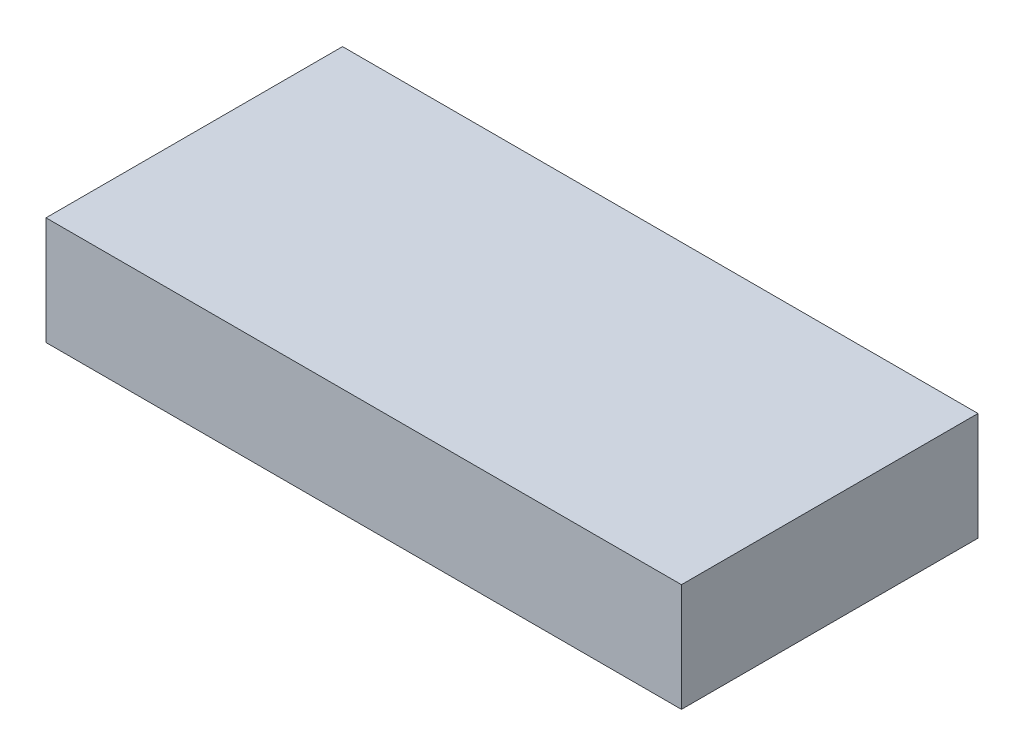
ISO-10303-21;
HEADER;
FILE_DESCRIPTION(('STEP AP214'),'2;1');
FILE_NAME('part.step','',(''),(''),'','','');
FILE_SCHEMA(('AUTOMOTIVE_DESIGN { 1 0 10303 214 1 1 1 1 }'));
ENDSEC;
DATA;
#1=APPLICATION_CONTEXT('core data for automotive mechanical design processes');
#2=APPLICATION_PROTOCOL_DEFINITION('international standard','automotive_design',2000,#1);
#3=PRODUCT_CONTEXT('',#1,'mechanical');
#4=PRODUCT('Part','Part','',(#3));
#5=PRODUCT_RELATED_PRODUCT_CATEGORY('part','',(#4));
#6=PRODUCT_DEFINITION_FORMATION('','',#4);
#7=PRODUCT_DEFINITION_CONTEXT('part definition',#1,'design');
#8=PRODUCT_DEFINITION('design','',#6,#7);
#9=PRODUCT_DEFINITION_SHAPE('','',#8);
#10=(LENGTH_UNIT() NAMED_UNIT(*) SI_UNIT(.MILLI.,.METRE.));
#11=(NAMED_UNIT(*) PLANE_ANGLE_UNIT() SI_UNIT($,.RADIAN.));
#12=(NAMED_UNIT(*) SI_UNIT($,.STERADIAN.) SOLID_ANGLE_UNIT());
#13=UNCERTAINTY_MEASURE_WITH_UNIT(LENGTH_MEASURE(1.E-05),#10,'distance_accuracy_value','');
#14=(GEOMETRIC_REPRESENTATION_CONTEXT(3) GLOBAL_UNCERTAINTY_ASSIGNED_CONTEXT((#13)) GLOBAL_UNIT_ASSIGNED_CONTEXT((#10,
#11,#12)) REPRESENTATION_CONTEXT('',''));
#15=CARTESIAN_POINT('',(0.,0.,0.));
#16=DIRECTION('',(0.,0.,1.));
#17=DIRECTION('',(1.,0.,0.));
#18=AXIS2_PLACEMENT_3D('',#15,#16,#17);
#19=CARTESIAN_POINT('',(-19.719298245614,10.2,-9.19298245614035));
#20=DIRECTION('',(1.,0.,0.));
#21=DIRECTION('',(0.,0.,-1.));
#22=AXIS2_PLACEMENT_3D('',#19,#20,#21);
#23=PLANE('',#22);
#24=DIRECTION('',(0.,0.,1.));
#25=VECTOR('',#24,1.);
#26=CARTESIAN_POINT('',(-19.719298245614,0.,-9.19298245614035));
#27=LINE('',#26,#25);
#28=CARTESIAN_POINT('',(-19.719298245614,0.,-9.19298245614035));
#29=VERTEX_POINT('',#28);
#30=CARTESIAN_POINT('',(-19.719298245614,0.,18.8070175438597));
#31=VERTEX_POINT('',#30);
#32=EDGE_CURVE('E107',#29,#31,#27,.T.);
#33=ORIENTED_EDGE('',*,*,#32,.T.);
#34=DIRECTION('',(0.,-1.,0.));
#35=VECTOR('',#34,1.);
#36=CARTESIAN_POINT('',(-19.719298245614,10.2,18.8070175438597));
#37=LINE('',#36,#35);
#38=CARTESIAN_POINT('',(-19.719298245614,10.2,18.8070175438597));
#39=VERTEX_POINT('',#38);
#40=EDGE_CURVE('E44',#39,#31,#37,.T.);
#41=ORIENTED_EDGE('',*,*,#40,.F.);
#42=DIRECTION('',(0.,0.,1.));
#43=VECTOR('',#42,1.);
#44=CARTESIAN_POINT('',(-19.719298245614,10.2,-9.19298245614035));
#45=LINE('',#44,#43);
#46=CARTESIAN_POINT('',(-19.719298245614,10.2,-9.19298245614035));
#47=VERTEX_POINT('',#46);
#48=EDGE_CURVE('E94',#47,#39,#45,.T.);
#49=ORIENTED_EDGE('',*,*,#48,.F.);
#50=DIRECTION('',(0.,-1.,0.));
#51=VECTOR('',#50,1.);
#52=CARTESIAN_POINT('',(-19.719298245614,10.2,-9.19298245614035));
#53=LINE('',#52,#51);
#54=EDGE_CURVE('E103',#47,#29,#53,.T.);
#55=ORIENTED_EDGE('',*,*,#54,.T.);
#56=EDGE_LOOP('',(#33,#41,#49,#55));
#57=FACE_BOUND('',#56,.T.);
#58=ADVANCED_FACE('F41',(#57),#23,.F.);
#59=CARTESIAN_POINT('',(-19.719298245614,10.2,18.8070175438597));
#60=DIRECTION('',(0.,0.,-1.));
#61=DIRECTION('',(-1.,0.,0.));
#62=AXIS2_PLACEMENT_3D('',#59,#60,#61);
#63=PLANE('',#62);
#64=DIRECTION('',(1.,0.,0.));
#65=VECTOR('',#64,1.);
#66=CARTESIAN_POINT('',(-19.719298245614,0.,18.8070175438597));
#67=LINE('',#66,#65);
#68=CARTESIAN_POINT('',(40.2807017543859,0.,18.8070175438597));
#69=VERTEX_POINT('',#68);
#70=EDGE_CURVE('E99',#31,#69,#67,.T.);
#71=ORIENTED_EDGE('',*,*,#70,.T.);
#72=DIRECTION('',(0.,-1.,0.));
#73=VECTOR('',#72,1.);
#74=CARTESIAN_POINT('',(40.2807017543859,10.2,18.8070175438597));
#75=LINE('',#74,#73);
#76=CARTESIAN_POINT('',(40.2807017543859,10.2,18.8070175438597));
#77=VERTEX_POINT('',#76);
#78=EDGE_CURVE('E97',#77,#69,#75,.T.);
#79=ORIENTED_EDGE('',*,*,#78,.F.);
#80=DIRECTION('',(1.,0.,0.));
#81=VECTOR('',#80,1.);
#82=CARTESIAN_POINT('',(-19.719298245614,10.2,18.8070175438597));
#83=LINE('',#82,#81);
#84=EDGE_CURVE('E89',#39,#77,#83,.T.);
#85=ORIENTED_EDGE('',*,*,#84,.F.);
#86=ORIENTED_EDGE('',*,*,#40,.T.);
#87=EDGE_LOOP('',(#71,#79,#85,#86));
#88=FACE_BOUND('',#87,.T.);
#89=ADVANCED_FACE('F98',(#88),#63,.F.);
#90=CARTESIAN_POINT('',(40.280701754386,10.2,-9.19298245614035));
#91=DIRECTION('',(-1.,0.,0.));
#92=DIRECTION('',(0.,0.,1.));
#93=AXIS2_PLACEMENT_3D('',#90,#91,#92);
#94=PLANE('',#93);
#95=DIRECTION('',(0.,0.,-1.));
#96=VECTOR('',#95,1.);
#97=CARTESIAN_POINT('',(40.280701754386,0.,-9.19298245614035));
#98=LINE('',#97,#96);
#99=CARTESIAN_POINT('',(40.280701754386,0.,-9.19298245614035));
#100=VERTEX_POINT('',#99);
#101=EDGE_CURVE('E75',#69,#100,#98,.T.);
#102=ORIENTED_EDGE('',*,*,#101,.T.);
#103=DIRECTION('',(0.,-1.,0.));
#104=VECTOR('',#103,1.);
#105=CARTESIAN_POINT('',(40.280701754386,10.2,-9.19298245614035));
#106=LINE('',#105,#104);
#107=CARTESIAN_POINT('',(40.280701754386,10.2,-9.19298245614035));
#108=VERTEX_POINT('',#107);
#109=EDGE_CURVE('E100',#108,#100,#106,.T.);
#110=ORIENTED_EDGE('',*,*,#109,.F.);
#111=DIRECTION('',(0.,0.,-1.));
#112=VECTOR('',#111,1.);
#113=CARTESIAN_POINT('',(40.280701754386,10.2,-9.19298245614035));
#114=LINE('',#113,#112);
#115=EDGE_CURVE('E92',#77,#108,#114,.T.);
#116=ORIENTED_EDGE('',*,*,#115,.F.);
#117=ORIENTED_EDGE('',*,*,#78,.T.);
#118=EDGE_LOOP('',(#102,#110,#116,#117));
#119=FACE_BOUND('',#118,.T.);
#120=ADVANCED_FACE('F101',(#119),#94,.F.);
#121=CARTESIAN_POINT('',(-19.719298245614,10.2,-9.19298245614035));
#122=DIRECTION('',(0.,0.,1.));
#123=DIRECTION('',(1.,0.,0.));
#124=AXIS2_PLACEMENT_3D('',#121,#122,#123);
#125=PLANE('',#124);
#126=DIRECTION('',(-1.,0.,0.));
#127=VECTOR('',#126,1.);
#128=CARTESIAN_POINT('',(-19.719298245614,0.,-9.19298245614035));
#129=LINE('',#128,#127);
#130=EDGE_CURVE('E81',#100,#29,#129,.T.);
#131=ORIENTED_EDGE('',*,*,#130,.T.);
#132=ORIENTED_EDGE('',*,*,#54,.F.);
#133=DIRECTION('',(-1.,0.,0.));
#134=VECTOR('',#133,1.);
#135=CARTESIAN_POINT('',(-19.719298245614,10.2,-9.19298245614035));
#136=LINE('',#135,#134);
#137=EDGE_CURVE('E58',#108,#47,#136,.T.);
#138=ORIENTED_EDGE('',*,*,#137,.F.);
#139=ORIENTED_EDGE('',*,*,#109,.T.);
#140=EDGE_LOOP('',(#131,#132,#138,#139));
#141=FACE_BOUND('',#140,.T.);
#142=ADVANCED_FACE('F115',(#141),#125,.F.);
#143=CARTESIAN_POINT('',(0.,10.2,0.));
#144=DIRECTION('',(0.,1.,0.));
#145=DIRECTION('',(0.,0.,1.));
#146=AXIS2_PLACEMENT_3D('',#143,#144,#145);
#147=PLANE('',#146);
#148=ORIENTED_EDGE('',*,*,#48,.T.);
#149=ORIENTED_EDGE('',*,*,#84,.T.);
#150=ORIENTED_EDGE('',*,*,#115,.T.);
#151=ORIENTED_EDGE('',*,*,#137,.T.);
#152=EDGE_LOOP('',(#148,#149,#150,#151));
#153=FACE_BOUND('',#152,.T.);
#154=ADVANCED_FACE('F90',(#153),#147,.T.);
#155=CARTESIAN_POINT('',(0.,0.,0.));
#156=DIRECTION('',(0.,1.,0.));
#157=DIRECTION('',(0.,0.,1.));
#158=AXIS2_PLACEMENT_3D('',#155,#156,#157);
#159=PLANE('',#158);
#160=CARTESIAN_POINT('',(21.2807017543859,0.,4.80701754385965));
#161=DIRECTION('',(0.,-1.,0.));
#162=DIRECTION('',(0.,0.,-1.));
#163=AXIS2_PLACEMENT_3D('',#160,#161,#162);
#164=CIRCLE('',#163,7.);
#165=CARTESIAN_POINT('',(21.2807017543859,0.,-2.19298245614035));
#166=VERTEX_POINT('',#165);
#167=EDGE_CURVE('E11',#166,#166,#164,.T.);
#168=ORIENTED_EDGE('',*,*,#167,.F.);
#169=EDGE_LOOP('',(#168));
#170=FACE_BOUND('',#169,.T.);
#171=ORIENTED_EDGE('',*,*,#32,.F.);
#172=ORIENTED_EDGE('',*,*,#130,.F.);
#173=ORIENTED_EDGE('',*,*,#101,.F.);
#174=ORIENTED_EDGE('',*,*,#70,.F.);
#175=EDGE_LOOP('',(#171,#172,#173,#174));
#176=FACE_BOUND('',#175,.T.);
#177=ADVANCED_FACE('F118',(#170,#176),#159,.F.);
#178=CARTESIAN_POINT('',(21.2807017543859,-2.4,4.80701754385965));
#179=DIRECTION('',(0.,1.,0.));
#180=DIRECTION('',(0.,0.,1.));
#181=AXIS2_PLACEMENT_3D('',#178,#179,#180);
#182=CYLINDRICAL_SURFACE('',#181,7.);
#183=CARTESIAN_POINT('',(21.2807017543859,-2.4,4.80701754385965));
#184=DIRECTION('',(0.,-1.,0.));
#185=DIRECTION('',(0.,0.,-1.));
#186=AXIS2_PLACEMENT_3D('',#183,#184,#185);
#187=CIRCLE('',#186,7.);
#188=CARTESIAN_POINT('',(21.2807017543859,-2.4,-2.19298245614035));
#189=VERTEX_POINT('',#188);
#190=EDGE_CURVE('E110',#189,#189,#187,.T.);
#191=ORIENTED_EDGE('',*,*,#190,.F.);
#192=EDGE_LOOP('',(#191));
#193=FACE_BOUND('',#192,.T.);
#194=ORIENTED_EDGE('',*,*,#167,.T.);
#195=EDGE_LOOP('',(#194));
#196=FACE_BOUND('',#195,.T.);
#197=ADVANCED_FACE('F126',(#193,#196),#182,.T.);
#198=CARTESIAN_POINT('',(21.2807017543859,-2.4,4.80701754385965));
#199=DIRECTION('',(0.,-1.,0.));
#200=DIRECTION('',(0.,0.,-1.));
#201=AXIS2_PLACEMENT_3D('',#198,#199,#200);
#202=PLANE('',#201);
#203=ORIENTED_EDGE('',*,*,#190,.T.);
#204=EDGE_LOOP('',(#203));
#205=FACE_BOUND('',#204,.T.);
#206=ADVANCED_FACE('F124',(#205),#202,.T.);
#207=CLOSED_SHELL('',(#58,#89,#120,#142,#154,#177,#197,#206));
#208=MANIFOLD_SOLID_BREP('B2',#207);
#209=ADVANCED_BREP_SHAPE_REPRESENTATION('',(#18,#208),#14);
#210=SHAPE_DEFINITION_REPRESENTATION(#9,#209);
ENDSEC;
END-ISO-10303-21;
